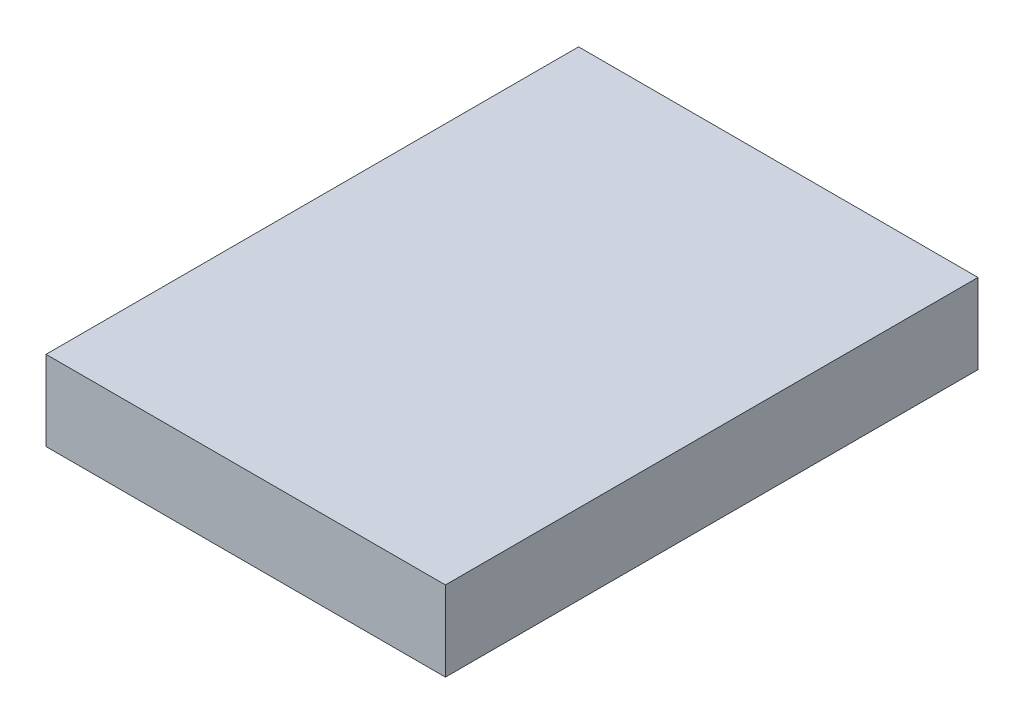
ISO-10303-21;
HEADER;
FILE_DESCRIPTION(('STEP AP214'),'2;1');
FILE_NAME('part.step','',(''),(''),'','','');
FILE_SCHEMA(('AUTOMOTIVE_DESIGN { 1 0 10303 214 1 1 1 1 }'));
ENDSEC;
DATA;
#1=APPLICATION_CONTEXT('core data for automotive mechanical design processes');
#2=APPLICATION_PROTOCOL_DEFINITION('international standard','automotive_design',2000,#1);
#3=PRODUCT_CONTEXT('',#1,'mechanical');
#4=PRODUCT('Part','Part','',(#3));
#5=PRODUCT_RELATED_PRODUCT_CATEGORY('part','',(#4));
#6=PRODUCT_DEFINITION_FORMATION('','',#4);
#7=PRODUCT_DEFINITION_CONTEXT('part definition',#1,'design');
#8=PRODUCT_DEFINITION('design','',#6,#7);
#9=PRODUCT_DEFINITION_SHAPE('','',#8);
#10=(LENGTH_UNIT() NAMED_UNIT(*) SI_UNIT(.MILLI.,.METRE.));
#11=(NAMED_UNIT(*) PLANE_ANGLE_UNIT() SI_UNIT($,.RADIAN.));
#12=(NAMED_UNIT(*) SI_UNIT($,.STERADIAN.) SOLID_ANGLE_UNIT());
#13=UNCERTAINTY_MEASURE_WITH_UNIT(LENGTH_MEASURE(1.E-05),#10,'distance_accuracy_value','');
#14=(GEOMETRIC_REPRESENTATION_CONTEXT(3) GLOBAL_UNCERTAINTY_ASSIGNED_CONTEXT((#13)) GLOBAL_UNIT_ASSIGNED_CONTEXT((#10,
#11,#12)) REPRESENTATION_CONTEXT('',''));
#15=CARTESIAN_POINT('',(0.,0.,0.));
#16=DIRECTION('',(0.,0.,1.));
#17=DIRECTION('',(1.,0.,0.));
#18=AXIS2_PLACEMENT_3D('',#15,#16,#17);
#19=CARTESIAN_POINT('',(0.,3.905,0.));
#20=DIRECTION('',(0.,1.,0.));
#21=DIRECTION('',(1.,0.,0.));
#22=AXIS2_PLACEMENT_3D('',#19,#20,#21);
#23=PLANE('',#22);
#24=DIRECTION('',(-1.,0.,0.));
#25=VECTOR('',#24,1.);
#26=CARTESIAN_POINT('',(0.,3.905,-1.99999999999993));
#27=LINE('',#26,#25);
#28=CARTESIAN_POINT('',(-9.,3.905,-1.99999999999993));
#29=VERTEX_POINT('',#28);
#30=CARTESIAN_POINT('',(-12.,3.905,-1.99999999999993));
#31=VERTEX_POINT('',#30);
#32=EDGE_CURVE('E11',#29,#31,#27,.T.);
#33=ORIENTED_EDGE('',*,*,#32,.T.);
#34=DIRECTION('',(0.,0.,1.));
#35=VECTOR('',#34,1.);
#36=CARTESIAN_POINT('',(-12.,3.905,0.));
#37=LINE('',#36,#35);
#38=CARTESIAN_POINT('',(-12.,3.905,2.00000000000007));
#39=VERTEX_POINT('',#38);
#40=EDGE_CURVE('E24',#31,#39,#37,.T.);
#41=ORIENTED_EDGE('',*,*,#40,.T.);
#42=DIRECTION('',(1.,0.,0.));
#43=VECTOR('',#42,1.);
#44=CARTESIAN_POINT('',(0.,3.905,2.00000000000007));
#45=LINE('',#44,#43);
#46=CARTESIAN_POINT('',(-9.,3.905,2.00000000000007));
#47=VERTEX_POINT('',#46);
#48=EDGE_CURVE('E88',#39,#47,#45,.T.);
#49=ORIENTED_EDGE('',*,*,#48,.T.);
#50=DIRECTION('',(0.,0.,-1.));
#51=VECTOR('',#50,1.);
#52=CARTESIAN_POINT('',(-9.,3.905,0.));
#53=LINE('',#52,#51);
#54=EDGE_CURVE('E59',#47,#29,#53,.T.);
#55=ORIENTED_EDGE('',*,*,#54,.T.);
#56=EDGE_LOOP('',(#33,#41,#49,#55));
#57=FACE_BOUND('',#56,.T.);
#58=ADVANCED_FACE('F17',(#57),#23,.T.);
#59=CARTESIAN_POINT('',(-12.,3.905,-1.99999999999993));
#60=DIRECTION('',(1.,0.,0.));
#61=DIRECTION('',(0.,1.,0.));
#62=AXIS2_PLACEMENT_3D('',#59,#60,#61);
#63=PLANE('',#62);
#64=DIRECTION('',(0.,-1.,0.));
#65=VECTOR('',#64,1.);
#66=CARTESIAN_POINT('',(-12.,3.905,2.00000000000007));
#67=LINE('',#66,#65);
#68=CARTESIAN_POINT('',(-12.,3.305,2.00000000000007));
#69=VERTEX_POINT('',#68);
#70=EDGE_CURVE('E75',#39,#69,#67,.T.);
#71=ORIENTED_EDGE('',*,*,#70,.F.);
#72=ORIENTED_EDGE('',*,*,#40,.F.);
#73=DIRECTION('',(0.,1.,0.));
#74=VECTOR('',#73,1.);
#75=CARTESIAN_POINT('',(-12.,3.905,-1.99999999999993));
#76=LINE('',#75,#74);
#77=CARTESIAN_POINT('',(-12.,3.305,-1.99999999999993));
#78=VERTEX_POINT('',#77);
#79=EDGE_CURVE('E84',#78,#31,#76,.T.);
#80=ORIENTED_EDGE('',*,*,#79,.F.);
#81=DIRECTION('',(0.,0.,-1.));
#82=VECTOR('',#81,1.);
#83=CARTESIAN_POINT('',(-12.,3.305,-1.99999999999993));
#84=LINE('',#83,#82);
#85=EDGE_CURVE('E82',#69,#78,#84,.T.);
#86=ORIENTED_EDGE('',*,*,#85,.F.);
#87=EDGE_LOOP('',(#71,#72,#80,#86));
#88=FACE_BOUND('',#87,.T.);
#89=ADVANCED_FACE('F90',(#88),#63,.F.);
#90=CARTESIAN_POINT('',(-9.,3.905,-1.99999999999993));
#91=DIRECTION('',(0.,0.,1.));
#92=DIRECTION('',(1.,0.,0.));
#93=AXIS2_PLACEMENT_3D('',#90,#91,#92);
#94=PLANE('',#93);
#95=ORIENTED_EDGE('',*,*,#79,.T.);
#96=ORIENTED_EDGE('',*,*,#32,.F.);
#97=DIRECTION('',(0.,1.,0.));
#98=VECTOR('',#97,1.);
#99=CARTESIAN_POINT('',(-9.,3.905,-1.99999999999993));
#100=LINE('',#99,#98);
#101=CARTESIAN_POINT('',(-9.,3.305,-1.99999999999993));
#102=VERTEX_POINT('',#101);
#103=EDGE_CURVE('E80',#102,#29,#100,.T.);
#104=ORIENTED_EDGE('',*,*,#103,.F.);
#105=DIRECTION('',(1.,0.,0.));
#106=VECTOR('',#105,1.);
#107=CARTESIAN_POINT('',(-9.,3.305,-1.99999999999993));
#108=LINE('',#107,#106);
#109=EDGE_CURVE('E63',#78,#102,#108,.T.);
#110=ORIENTED_EDGE('',*,*,#109,.F.);
#111=EDGE_LOOP('',(#95,#96,#104,#110));
#112=FACE_BOUND('',#111,.T.);
#113=ADVANCED_FACE('F91',(#112),#94,.F.);
#114=CARTESIAN_POINT('',(-9.,3.905,2.00000000000007));
#115=DIRECTION('',(-1.,0.,0.));
#116=DIRECTION('',(0.,0.,1.));
#117=AXIS2_PLACEMENT_3D('',#114,#115,#116);
#118=PLANE('',#117);
#119=ORIENTED_EDGE('',*,*,#103,.T.);
#120=ORIENTED_EDGE('',*,*,#54,.F.);
#121=DIRECTION('',(0.,1.,0.));
#122=VECTOR('',#121,1.);
#123=CARTESIAN_POINT('',(-9.,3.905,2.00000000000007));
#124=LINE('',#123,#122);
#125=CARTESIAN_POINT('',(-9.,3.305,2.00000000000007));
#126=VERTEX_POINT('',#125);
#127=EDGE_CURVE('E54',#126,#47,#124,.T.);
#128=ORIENTED_EDGE('',*,*,#127,.F.);
#129=DIRECTION('',(0.,0.,1.));
#130=VECTOR('',#129,1.);
#131=CARTESIAN_POINT('',(-9.,3.305,2.00000000000007));
#132=LINE('',#131,#130);
#133=EDGE_CURVE('E58',#102,#126,#132,.T.);
#134=ORIENTED_EDGE('',*,*,#133,.F.);
#135=EDGE_LOOP('',(#119,#120,#128,#134));
#136=FACE_BOUND('',#135,.T.);
#137=ADVANCED_FACE('F57',(#136),#118,.F.);
#138=CARTESIAN_POINT('',(-12.,3.905,2.00000000000007));
#139=DIRECTION('',(0.,0.,-1.));
#140=DIRECTION('',(0.,-1.,0.));
#141=AXIS2_PLACEMENT_3D('',#138,#139,#140);
#142=PLANE('',#141);
#143=ORIENTED_EDGE('',*,*,#127,.T.);
#144=ORIENTED_EDGE('',*,*,#48,.F.);
#145=ORIENTED_EDGE('',*,*,#70,.T.);
#146=DIRECTION('',(-1.,0.,0.));
#147=VECTOR('',#146,1.);
#148=CARTESIAN_POINT('',(-12.,3.305,2.00000000000007));
#149=LINE('',#148,#147);
#150=EDGE_CURVE('E70',#126,#69,#149,.T.);
#151=ORIENTED_EDGE('',*,*,#150,.F.);
#152=EDGE_LOOP('',(#143,#144,#145,#151));
#153=FACE_BOUND('',#152,.T.);
#154=ADVANCED_FACE('F73',(#153),#142,.F.);
#155=CARTESIAN_POINT('',(0.,3.305,0.));
#156=DIRECTION('',(0.,1.,0.));
#157=DIRECTION('',(1.,0.,0.));
#158=AXIS2_PLACEMENT_3D('',#155,#156,#157);
#159=PLANE('',#158);
#160=ORIENTED_EDGE('',*,*,#85,.T.);
#161=ORIENTED_EDGE('',*,*,#109,.T.);
#162=ORIENTED_EDGE('',*,*,#133,.T.);
#163=ORIENTED_EDGE('',*,*,#150,.T.);
#164=EDGE_LOOP('',(#160,#161,#162,#163));
#165=FACE_BOUND('',#164,.T.);
#166=ADVANCED_FACE('F69',(#165),#159,.F.);
#167=CLOSED_SHELL('',(#58,#89,#113,#137,#154,#166));
#168=MANIFOLD_SOLID_BREP('B1',#167);
#169=ADVANCED_BREP_SHAPE_REPRESENTATION('',(#18,#168),#14);
#170=SHAPE_DEFINITION_REPRESENTATION(#9,#169);
ENDSEC;
END-ISO-10303-21;
